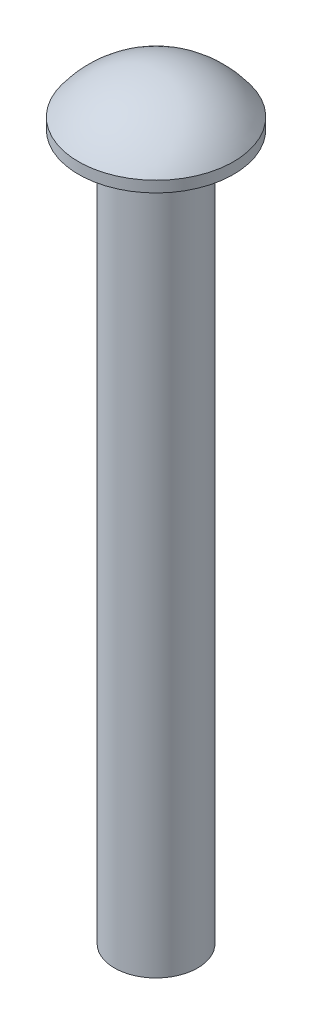
ISO-10303-21;
HEADER;
FILE_DESCRIPTION(('STEP AP214'),'2;1');
FILE_NAME('part.step','',(''),(''),'','','');
FILE_SCHEMA(('AUTOMOTIVE_DESIGN { 1 0 10303 214 1 1 1 1 }'));
ENDSEC;
DATA;
#1=APPLICATION_CONTEXT('core data for automotive mechanical design processes');
#2=APPLICATION_PROTOCOL_DEFINITION('international standard','automotive_design',2000,#1);
#3=PRODUCT_CONTEXT('',#1,'mechanical');
#4=PRODUCT('Part','Part','',(#3));
#5=PRODUCT_RELATED_PRODUCT_CATEGORY('part','',(#4));
#6=PRODUCT_DEFINITION_FORMATION('','',#4);
#7=PRODUCT_DEFINITION_CONTEXT('part definition',#1,'design');
#8=PRODUCT_DEFINITION('design','',#6,#7);
#9=PRODUCT_DEFINITION_SHAPE('','',#8);
#10=(LENGTH_UNIT() NAMED_UNIT(*) SI_UNIT(.MILLI.,.METRE.));
#11=(NAMED_UNIT(*) PLANE_ANGLE_UNIT() SI_UNIT($,.RADIAN.));
#12=(NAMED_UNIT(*) SI_UNIT($,.STERADIAN.) SOLID_ANGLE_UNIT());
#13=UNCERTAINTY_MEASURE_WITH_UNIT(LENGTH_MEASURE(1.E-05),#10,'distance_accuracy_value','');
#14=(GEOMETRIC_REPRESENTATION_CONTEXT(3) GLOBAL_UNCERTAINTY_ASSIGNED_CONTEXT((#13)) GLOBAL_UNIT_ASSIGNED_CONTEXT((#10,
#11,#12)) REPRESENTATION_CONTEXT('',''));
#15=CARTESIAN_POINT('',(0.,0.,0.));
#16=DIRECTION('',(0.,0.,1.));
#17=DIRECTION('',(1.,0.,0.));
#18=AXIS2_PLACEMENT_3D('',#15,#16,#17);
#19=CARTESIAN_POINT('',(0.,0.,0.));
#20=DIRECTION('',(0.,-1.,0.));
#21=DIRECTION('',(0.,0.,-1.));
#22=AXIS2_PLACEMENT_3D('',#19,#20,#21);
#23=CYLINDRICAL_SURFACE('',#22,1.5);
#24=CARTESIAN_POINT('',(0.,0.,0.));
#25=DIRECTION('',(0.,-1.,0.));
#26=DIRECTION('',(0.,0.,-1.));
#27=AXIS2_PLACEMENT_3D('',#24,#25,#26);
#28=CIRCLE('',#27,1.5);
#29=CARTESIAN_POINT('',(0.,0.,-1.5));
#30=VERTEX_POINT('',#29);
#31=EDGE_CURVE('E60',#30,#30,#28,.T.);
#32=ORIENTED_EDGE('',*,*,#31,.F.);
#33=EDGE_LOOP('',(#32));
#34=FACE_BOUND('',#33,.T.);
#35=CARTESIAN_POINT('',(0.,25.4,0.));
#36=DIRECTION('',(0.,-1.,0.));
#37=DIRECTION('',(0.,0.,-1.));
#38=AXIS2_PLACEMENT_3D('',#35,#36,#37);
#39=CIRCLE('',#38,1.5);
#40=CARTESIAN_POINT('',(0.,25.4,-1.5));
#41=VERTEX_POINT('',#40);
#42=EDGE_CURVE('E10',#41,#41,#39,.T.);
#43=ORIENTED_EDGE('',*,*,#42,.T.);
#44=EDGE_LOOP('',(#43));
#45=FACE_BOUND('',#44,.T.);
#46=ADVANCED_FACE('F43',(#34,#45),#23,.T.);
#47=CARTESIAN_POINT('',(-1.5,25.4,0.));
#48=DIRECTION('',(0.,1.,0.));
#49=DIRECTION('',(0.,0.,1.));
#50=AXIS2_PLACEMENT_3D('',#47,#48,#49);
#51=PLANE('',#50);
#52=ORIENTED_EDGE('',*,*,#42,.F.);
#53=EDGE_LOOP('',(#52));
#54=FACE_BOUND('',#53,.T.);
#55=CARTESIAN_POINT('',(0.,25.4,0.));
#56=DIRECTION('',(0.,-1.,0.));
#57=DIRECTION('',(0.,0.,-1.));
#58=AXIS2_PLACEMENT_3D('',#55,#56,#57);
#59=CIRCLE('',#58,2.794);
#60=CARTESIAN_POINT('',(0.,25.4,-2.794));
#61=VERTEX_POINT('',#60);
#62=EDGE_CURVE('E50',#61,#61,#59,.T.);
#63=ORIENTED_EDGE('',*,*,#62,.T.);
#64=EDGE_LOOP('',(#63));
#65=FACE_BOUND('',#64,.T.);
#66=ADVANCED_FACE('F70',(#54,#65),#51,.F.);
#67=CARTESIAN_POINT('',(0.,0.,0.));
#68=DIRECTION('',(0.,-1.,0.));
#69=DIRECTION('',(0.,0.,-1.));
#70=AXIS2_PLACEMENT_3D('',#67,#68,#69);
#71=CYLINDRICAL_SURFACE('',#70,2.794);
#72=ORIENTED_EDGE('',*,*,#62,.F.);
#73=EDGE_LOOP('',(#72));
#74=FACE_BOUND('',#73,.T.);
#75=CARTESIAN_POINT('',(0.,25.796875,0.));
#76=DIRECTION('',(0.,-1.,0.));
#77=DIRECTION('',(0.,0.,-1.));
#78=AXIS2_PLACEMENT_3D('',#75,#76,#77);
#79=CIRCLE('',#78,2.794);
#80=CARTESIAN_POINT('',(0.,25.796875,-2.794));
#81=VERTEX_POINT('',#80);
#82=EDGE_CURVE('E55',#81,#81,#79,.T.);
#83=ORIENTED_EDGE('',*,*,#82,.T.);
#84=EDGE_LOOP('',(#83));
#85=FACE_BOUND('',#84,.T.);
#86=ADVANCED_FACE('F74',(#74,#85),#71,.T.);
#87=CARTESIAN_POINT('',(0.,23.8125,0.));
#88=DIRECTION('',(0.,-1.,0.));
#89=DIRECTION('',(-1.,0.,0.));
#90=AXIS2_PLACEMENT_3D('',#87,#88,#89);
#91=SPHERICAL_SURFACE('',#90,3.42697828131796);
#92=ORIENTED_EDGE('',*,*,#82,.F.);
#93=EDGE_LOOP('',(#92));
#94=FACE_BOUND('',#93,.T.);
#95=ADVANCED_FACE('F79',(#94),#91,.T.);
#96=CARTESIAN_POINT('',(0.,0.,0.));
#97=DIRECTION('',(0.,1.,0.));
#98=DIRECTION('',(0.,0.,1.));
#99=AXIS2_PLACEMENT_3D('',#96,#97,#98);
#100=PLANE('',#99);
#101=ORIENTED_EDGE('',*,*,#31,.T.);
#102=EDGE_LOOP('',(#101));
#103=FACE_BOUND('',#102,.T.);
#104=ADVANCED_FACE('F67',(#103),#100,.F.);
#105=CLOSED_SHELL('',(#46,#66,#86,#95,#104));
#106=MANIFOLD_SOLID_BREP('B2',#105);
#107=ADVANCED_BREP_SHAPE_REPRESENTATION('',(#18,#106),#14);
#108=SHAPE_DEFINITION_REPRESENTATION(#9,#107);
ENDSEC;
END-ISO-10303-21;
